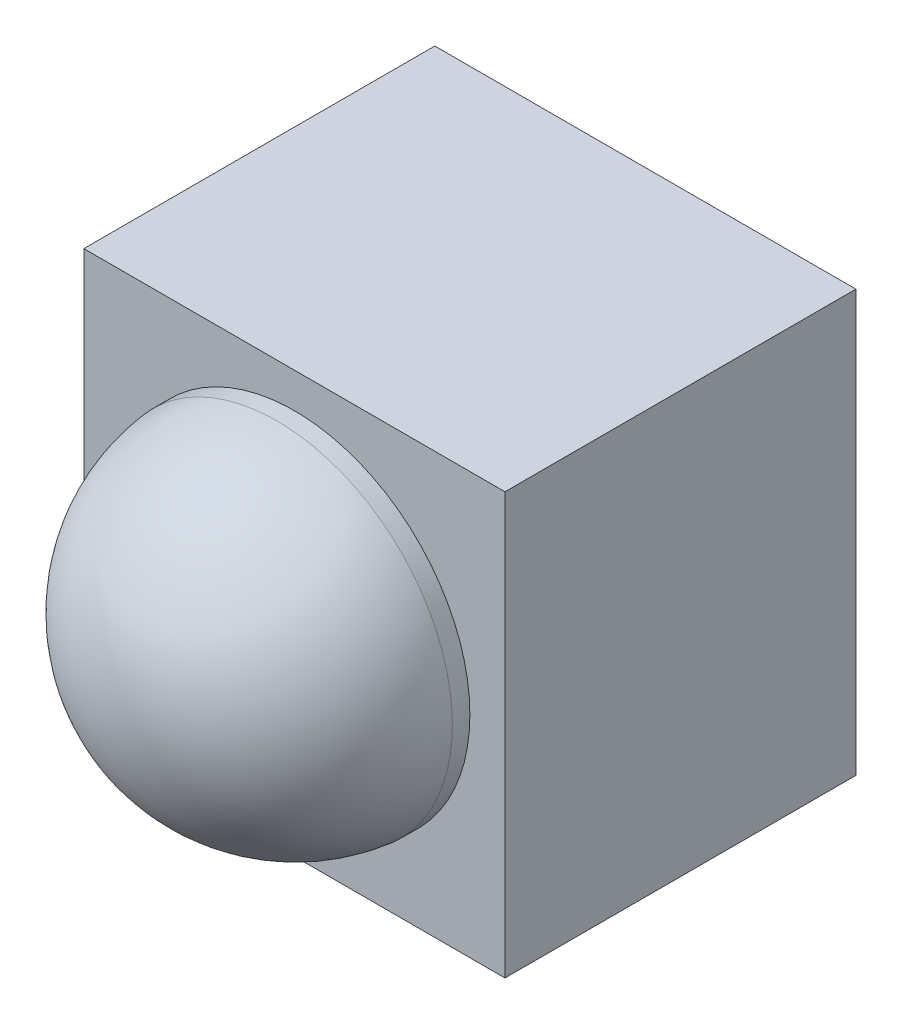
ISO-10303-21;
HEADER;
FILE_DESCRIPTION(('STEP AP214'),'2;1');
FILE_NAME('part.step','',(''),(''),'','','');
FILE_SCHEMA(('AUTOMOTIVE_DESIGN { 1 0 10303 214 1 1 1 1 }'));
ENDSEC;
DATA;
#1=APPLICATION_CONTEXT('core data for automotive mechanical design processes');
#2=APPLICATION_PROTOCOL_DEFINITION('international standard','automotive_design',2000,#1);
#3=PRODUCT_CONTEXT('',#1,'mechanical');
#4=PRODUCT('Part','Part','',(#3));
#5=PRODUCT_RELATED_PRODUCT_CATEGORY('part','',(#4));
#6=PRODUCT_DEFINITION_FORMATION('','',#4);
#7=PRODUCT_DEFINITION_CONTEXT('part definition',#1,'design');
#8=PRODUCT_DEFINITION('design','',#6,#7);
#9=PRODUCT_DEFINITION_SHAPE('','',#8);
#10=(LENGTH_UNIT() NAMED_UNIT(*) SI_UNIT(.MILLI.,.METRE.));
#11=(NAMED_UNIT(*) PLANE_ANGLE_UNIT() SI_UNIT($,.RADIAN.));
#12=(NAMED_UNIT(*) SI_UNIT($,.STERADIAN.) SOLID_ANGLE_UNIT());
#13=UNCERTAINTY_MEASURE_WITH_UNIT(LENGTH_MEASURE(1.E-05),#10,'distance_accuracy_value','');
#14=(GEOMETRIC_REPRESENTATION_CONTEXT(3) GLOBAL_UNCERTAINTY_ASSIGNED_CONTEXT((#13)) GLOBAL_UNIT_ASSIGNED_CONTEXT((#10,
#11,#12)) REPRESENTATION_CONTEXT('',''));
#15=CARTESIAN_POINT('',(0.,0.,0.));
#16=DIRECTION('',(0.,0.,1.));
#17=DIRECTION('',(1.,0.,0.));
#18=AXIS2_PLACEMENT_3D('',#15,#16,#17);
#19=CARTESIAN_POINT('',(-1.2,-1.2,2.));
#20=DIRECTION('',(1.,0.,0.));
#21=DIRECTION('',(0.,0.,-1.));
#22=AXIS2_PLACEMENT_3D('',#19,#20,#21);
#23=PLANE('',#22);
#24=DIRECTION('',(0.,-1.,0.));
#25=VECTOR('',#24,1.);
#26=CARTESIAN_POINT('',(-1.2,-1.2,0.));
#27=LINE('',#26,#25);
#28=CARTESIAN_POINT('',(-1.2,1.2,0.));
#29=VERTEX_POINT('',#28);
#30=CARTESIAN_POINT('',(-1.2,-1.2,0.));
#31=VERTEX_POINT('',#30);
#32=EDGE_CURVE('E105',#29,#31,#27,.T.);
#33=ORIENTED_EDGE('',*,*,#32,.T.);
#34=DIRECTION('',(0.,0.,-1.));
#35=VECTOR('',#34,1.);
#36=CARTESIAN_POINT('',(-1.2,-1.2,2.));
#37=LINE('',#36,#35);
#38=CARTESIAN_POINT('',(-1.2,-1.2,2.));
#39=VERTEX_POINT('',#38);
#40=EDGE_CURVE('E46',#39,#31,#37,.T.);
#41=ORIENTED_EDGE('',*,*,#40,.F.);
#42=DIRECTION('',(0.,-1.,0.));
#43=VECTOR('',#42,1.);
#44=CARTESIAN_POINT('',(-1.2,-1.2,2.));
#45=LINE('',#44,#43);
#46=CARTESIAN_POINT('',(-1.2,1.2,2.));
#47=VERTEX_POINT('',#46);
#48=EDGE_CURVE('E91',#47,#39,#45,.T.);
#49=ORIENTED_EDGE('',*,*,#48,.F.);
#50=DIRECTION('',(0.,0.,-1.));
#51=VECTOR('',#50,1.);
#52=CARTESIAN_POINT('',(-1.2,1.2,2.));
#53=LINE('',#52,#51);
#54=EDGE_CURVE('E101',#47,#29,#53,.T.);
#55=ORIENTED_EDGE('',*,*,#54,.T.);
#56=EDGE_LOOP('',(#33,#41,#49,#55));
#57=FACE_BOUND('',#56,.T.);
#58=ADVANCED_FACE('F36',(#57),#23,.F.);
#59=CARTESIAN_POINT('',(-1.2,-1.2,2.));
#60=DIRECTION('',(0.,1.,0.));
#61=DIRECTION('',(0.,0.,1.));
#62=AXIS2_PLACEMENT_3D('',#59,#60,#61);
#63=PLANE('',#62);
#64=DIRECTION('',(1.,0.,0.));
#65=VECTOR('',#64,1.);
#66=CARTESIAN_POINT('',(-1.2,-1.2,0.));
#67=LINE('',#66,#65);
#68=CARTESIAN_POINT('',(1.2,-1.2,0.));
#69=VERTEX_POINT('',#68);
#70=EDGE_CURVE('E96',#31,#69,#67,.T.);
#71=ORIENTED_EDGE('',*,*,#70,.T.);
#72=DIRECTION('',(0.,0.,-1.));
#73=VECTOR('',#72,1.);
#74=CARTESIAN_POINT('',(1.2,-1.2,2.));
#75=LINE('',#74,#73);
#76=CARTESIAN_POINT('',(1.2,-1.2,2.));
#77=VERTEX_POINT('',#76);
#78=EDGE_CURVE('E94',#77,#69,#75,.T.);
#79=ORIENTED_EDGE('',*,*,#78,.F.);
#80=DIRECTION('',(1.,0.,0.));
#81=VECTOR('',#80,1.);
#82=CARTESIAN_POINT('',(-1.2,-1.2,2.));
#83=LINE('',#82,#81);
#84=EDGE_CURVE('E86',#39,#77,#83,.T.);
#85=ORIENTED_EDGE('',*,*,#84,.F.);
#86=ORIENTED_EDGE('',*,*,#40,.T.);
#87=EDGE_LOOP('',(#71,#79,#85,#86));
#88=FACE_BOUND('',#87,.T.);
#89=ADVANCED_FACE('F95',(#88),#63,.F.);
#90=CARTESIAN_POINT('',(1.2,-1.2,2.));
#91=DIRECTION('',(-1.,0.,0.));
#92=DIRECTION('',(0.,-1.,0.));
#93=AXIS2_PLACEMENT_3D('',#90,#91,#92);
#94=PLANE('',#93);
#95=DIRECTION('',(0.,1.,0.));
#96=VECTOR('',#95,1.);
#97=CARTESIAN_POINT('',(1.2,-1.2,0.));
#98=LINE('',#97,#96);
#99=CARTESIAN_POINT('',(1.2,1.2,0.));
#100=VERTEX_POINT('',#99);
#101=EDGE_CURVE('E72',#69,#100,#98,.T.);
#102=ORIENTED_EDGE('',*,*,#101,.T.);
#103=DIRECTION('',(0.,0.,-1.));
#104=VECTOR('',#103,1.);
#105=CARTESIAN_POINT('',(1.2,1.2,2.));
#106=LINE('',#105,#104);
#107=CARTESIAN_POINT('',(1.2,1.2,2.));
#108=VERTEX_POINT('',#107);
#109=EDGE_CURVE('E97',#108,#100,#106,.T.);
#110=ORIENTED_EDGE('',*,*,#109,.F.);
#111=DIRECTION('',(0.,1.,0.));
#112=VECTOR('',#111,1.);
#113=CARTESIAN_POINT('',(1.2,-1.2,2.));
#114=LINE('',#113,#112);
#115=EDGE_CURVE('E89',#77,#108,#114,.T.);
#116=ORIENTED_EDGE('',*,*,#115,.F.);
#117=ORIENTED_EDGE('',*,*,#78,.T.);
#118=EDGE_LOOP('',(#102,#110,#116,#117));
#119=FACE_BOUND('',#118,.T.);
#120=ADVANCED_FACE('F99',(#119),#94,.F.);
#121=CARTESIAN_POINT('',(-1.2,1.2,2.));
#122=DIRECTION('',(0.,-1.,0.));
#123=DIRECTION('',(1.,0.,0.));
#124=AXIS2_PLACEMENT_3D('',#121,#122,#123);
#125=PLANE('',#124);
#126=DIRECTION('',(-1.,0.,0.));
#127=VECTOR('',#126,1.);
#128=CARTESIAN_POINT('',(-1.2,1.2,0.));
#129=LINE('',#128,#127);
#130=EDGE_CURVE('E78',#100,#29,#129,.T.);
#131=ORIENTED_EDGE('',*,*,#130,.T.);
#132=ORIENTED_EDGE('',*,*,#54,.F.);
#133=DIRECTION('',(-1.,0.,0.));
#134=VECTOR('',#133,1.);
#135=CARTESIAN_POINT('',(-1.2,1.2,2.));
#136=LINE('',#135,#134);
#137=EDGE_CURVE('E55',#108,#47,#136,.T.);
#138=ORIENTED_EDGE('',*,*,#137,.F.);
#139=ORIENTED_EDGE('',*,*,#109,.T.);
#140=EDGE_LOOP('',(#131,#132,#138,#139));
#141=FACE_BOUND('',#140,.T.);
#142=ADVANCED_FACE('F125',(#141),#125,.F.);
#143=CARTESIAN_POINT('',(0.,0.,2.));
#144=DIRECTION('',(0.,0.,-1.));
#145=DIRECTION('',(-1.,0.,0.));
#146=AXIS2_PLACEMENT_3D('',#143,#144,#145);
#147=PLANE('',#146);
#148=CARTESIAN_POINT('',(0.,0.,2.));
#149=DIRECTION('',(0.,0.,1.));
#150=DIRECTION('',(1.,0.,0.));
#151=AXIS2_PLACEMENT_3D('',#148,#149,#150);
#152=CIRCLE('',#151,1.);
#153=CARTESIAN_POINT('',(1.,0.,2.));
#154=VERTEX_POINT('',#153);
#155=EDGE_CURVE('E12',#154,#154,#152,.T.);
#156=ORIENTED_EDGE('',*,*,#155,.F.);
#157=EDGE_LOOP('',(#156));
#158=FACE_BOUND('',#157,.T.);
#159=ORIENTED_EDGE('',*,*,#48,.T.);
#160=ORIENTED_EDGE('',*,*,#84,.T.);
#161=ORIENTED_EDGE('',*,*,#115,.T.);
#162=ORIENTED_EDGE('',*,*,#137,.T.);
#163=EDGE_LOOP('',(#159,#160,#161,#162));
#164=FACE_BOUND('',#163,.T.);
#165=ADVANCED_FACE('F87',(#158,#164),#147,.F.);
#166=CARTESIAN_POINT('',(0.,0.,0.));
#167=DIRECTION('',(0.,0.,-1.));
#168=DIRECTION('',(-1.,0.,0.));
#169=AXIS2_PLACEMENT_3D('',#166,#167,#168);
#170=PLANE('',#169);
#171=ORIENTED_EDGE('',*,*,#32,.F.);
#172=ORIENTED_EDGE('',*,*,#130,.F.);
#173=ORIENTED_EDGE('',*,*,#101,.F.);
#174=ORIENTED_EDGE('',*,*,#70,.F.);
#175=EDGE_LOOP('',(#171,#172,#173,#174));
#176=FACE_BOUND('',#175,.T.);
#177=ADVANCED_FACE('F115',(#176),#170,.T.);
#178=CARTESIAN_POINT('',(0.,0.,2.1));
#179=DIRECTION('',(0.,0.,-1.));
#180=DIRECTION('',(-1.,0.,0.));
#181=AXIS2_PLACEMENT_3D('',#178,#179,#180);
#182=CYLINDRICAL_SURFACE('',#181,1.);
#183=CARTESIAN_POINT('',(0.,0.,2.1));
#184=DIRECTION('',(0.,0.,1.));
#185=DIRECTION('',(1.,0.,0.));
#186=AXIS2_PLACEMENT_3D('',#183,#184,#185);
#187=CIRCLE('',#186,1.);
#188=CARTESIAN_POINT('',(1.,0.,2.1));
#189=VERTEX_POINT('',#188);
#190=EDGE_CURVE('E40',#189,#189,#187,.T.);
#191=ORIENTED_EDGE('',*,*,#190,.F.);
#192=EDGE_LOOP('',(#191));
#193=FACE_BOUND('',#192,.T.);
#194=ORIENTED_EDGE('',*,*,#155,.T.);
#195=EDGE_LOOP('',(#194));
#196=FACE_BOUND('',#195,.T.);
#197=ADVANCED_FACE('F117',(#193,#196),#182,.T.);
#198=CARTESIAN_POINT('',(0.,0.,1.99444444444444));
#199=DIRECTION('',(0.,0.,1.));
#200=DIRECTION('',(1.,0.,0.));
#201=AXIS2_PLACEMENT_3D('',#198,#199,#200);
#202=SPHERICAL_SURFACE('',#201,1.00555555555556);
#203=ORIENTED_EDGE('',*,*,#190,.T.);
#204=EDGE_LOOP('',(#203));
#205=FACE_BOUND('',#204,.T.);
#206=ADVANCED_FACE('F38',(#205),#202,.T.);
#207=CLOSED_SHELL('',(#58,#89,#120,#142,#165,#177,#197,#206));
#208=MANIFOLD_SOLID_BREP('B2',#207);
#209=ADVANCED_BREP_SHAPE_REPRESENTATION('',(#18,#208),#14);
#210=SHAPE_DEFINITION_REPRESENTATION(#9,#209);
ENDSEC;
END-ISO-10303-21;
